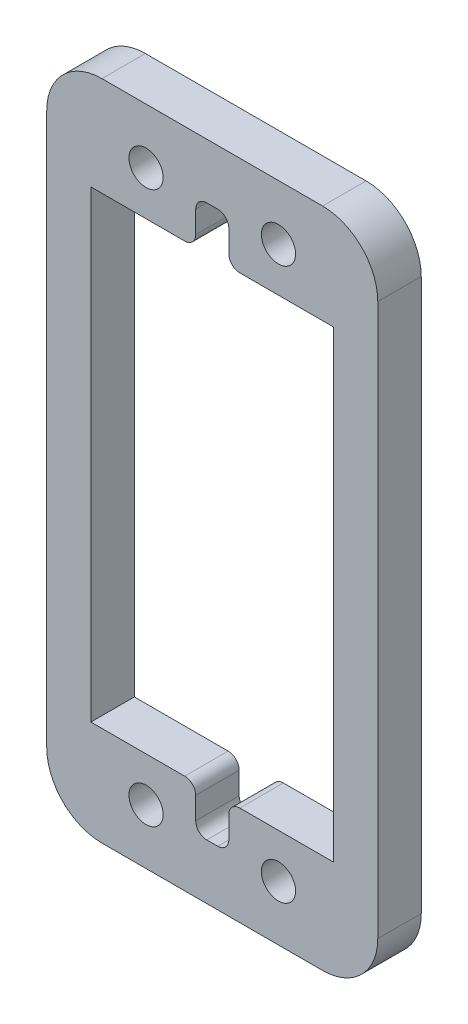
ISO-10303-21;
HEADER;
FILE_DESCRIPTION(('STEP AP214'),'2;1');
FILE_NAME('part.step','',(''),(''),'','','');
FILE_SCHEMA(('AUTOMOTIVE_DESIGN { 1 0 10303 214 1 1 1 1 }'));
ENDSEC;
DATA;
#1=APPLICATION_CONTEXT('core data for automotive mechanical design processes');
#2=APPLICATION_PROTOCOL_DEFINITION('international standard','automotive_design',2000,#1);
#3=PRODUCT_CONTEXT('',#1,'mechanical');
#4=PRODUCT('Part','Part','',(#3));
#5=PRODUCT_RELATED_PRODUCT_CATEGORY('part','',(#4));
#6=PRODUCT_DEFINITION_FORMATION('','',#4);
#7=PRODUCT_DEFINITION_CONTEXT('part definition',#1,'design');
#8=PRODUCT_DEFINITION('design','',#6,#7);
#9=PRODUCT_DEFINITION_SHAPE('','',#8);
#10=(LENGTH_UNIT() NAMED_UNIT(*) SI_UNIT(.MILLI.,.METRE.));
#11=(NAMED_UNIT(*) PLANE_ANGLE_UNIT() SI_UNIT($,.RADIAN.));
#12=(NAMED_UNIT(*) SI_UNIT($,.STERADIAN.) SOLID_ANGLE_UNIT());
#13=UNCERTAINTY_MEASURE_WITH_UNIT(LENGTH_MEASURE(1.E-05),#10,'distance_accuracy_value','');
#14=(GEOMETRIC_REPRESENTATION_CONTEXT(3) GLOBAL_UNCERTAINTY_ASSIGNED_CONTEXT((#13)) GLOBAL_UNIT_ASSIGNED_CONTEXT((#10,
#11,#12)) REPRESENTATION_CONTEXT('',''));
#15=CARTESIAN_POINT('',(0.,0.,0.));
#16=DIRECTION('',(0.,0.,1.));
#17=DIRECTION('',(1.,0.,0.));
#18=AXIS2_PLACEMENT_3D('',#15,#16,#17);
#19=CARTESIAN_POINT('',(11.,21.,3.94));
#20=DIRECTION('',(0.,1.,0.));
#21=DIRECTION('',(0.,0.,1.));
#22=AXIS2_PLACEMENT_3D('',#19,#20,#21);
#23=PLANE('',#22);
#24=DIRECTION('',(1.,0.,0.));
#25=VECTOR('',#24,1.);
#26=CARTESIAN_POINT('',(11.,21.,0.));
#27=LINE('',#26,#25);
#28=CARTESIAN_POINT('',(-11.,21.,0.));
#29=VERTEX_POINT('',#28);
#30=CARTESIAN_POINT('',(-2.5,21.,0.));
#31=VERTEX_POINT('',#30);
#32=EDGE_CURVE('E251',#29,#31,#27,.T.);
#33=ORIENTED_EDGE('',*,*,#32,.T.);
#34=DIRECTION('',(0.,0.,1.));
#35=VECTOR('',#34,1.);
#36=CARTESIAN_POINT('',(-2.5,21.,3.94));
#37=LINE('',#36,#35);
#38=CARTESIAN_POINT('',(-2.5,21.,3.94));
#39=VERTEX_POINT('',#38);
#40=EDGE_CURVE('E388',#31,#39,#37,.T.);
#41=ORIENTED_EDGE('',*,*,#40,.T.);
#42=DIRECTION('',(1.,0.,0.));
#43=VECTOR('',#42,1.);
#44=CARTESIAN_POINT('',(11.,21.,3.94));
#45=LINE('',#44,#43);
#46=CARTESIAN_POINT('',(-11.,21.,3.94));
#47=VERTEX_POINT('',#46);
#48=EDGE_CURVE('E238',#47,#39,#45,.T.);
#49=ORIENTED_EDGE('',*,*,#48,.F.);
#50=DIRECTION('',(0.,0.,-1.));
#51=VECTOR('',#50,1.);
#52=CARTESIAN_POINT('',(-11.,21.,3.94));
#53=LINE('',#52,#51);
#54=EDGE_CURVE('E279',#47,#29,#53,.T.);
#55=ORIENTED_EDGE('',*,*,#54,.T.);
#56=EDGE_LOOP('',(#33,#41,#49,#55));
#57=FACE_BOUND('',#56,.T.);
#58=ADVANCED_FACE('F41',(#57),#23,.F.);
#59=CARTESIAN_POINT('',(-11.,-21.,3.94));
#60=DIRECTION('',(0.,-1.,0.));
#61=DIRECTION('',(0.,0.,-1.));
#62=AXIS2_PLACEMENT_3D('',#59,#60,#61);
#63=PLANE('',#62);
#64=DIRECTION('',(-1.,0.,0.));
#65=VECTOR('',#64,1.);
#66=CARTESIAN_POINT('',(-11.,-21.,3.94));
#67=LINE('',#66,#65);
#68=CARTESIAN_POINT('',(-2.50000000000001,-21.,3.94));
#69=VERTEX_POINT('',#68);
#70=CARTESIAN_POINT('',(-11.,-21.,3.94));
#71=VERTEX_POINT('',#70);
#72=EDGE_CURVE('E246',#69,#71,#67,.T.);
#73=ORIENTED_EDGE('',*,*,#72,.F.);
#74=DIRECTION('',(0.,0.,-1.));
#75=VECTOR('',#74,1.);
#76=CARTESIAN_POINT('',(-2.50000000000001,-21.,3.94));
#77=LINE('',#76,#75);
#78=CARTESIAN_POINT('',(-2.50000000000001,-21.,0.));
#79=VERTEX_POINT('',#78);
#80=EDGE_CURVE('E353',#69,#79,#77,.T.);
#81=ORIENTED_EDGE('',*,*,#80,.T.);
#82=DIRECTION('',(-1.,0.,0.));
#83=VECTOR('',#82,1.);
#84=CARTESIAN_POINT('',(-11.,-21.,0.));
#85=LINE('',#84,#83);
#86=CARTESIAN_POINT('',(-11.,-21.,0.));
#87=VERTEX_POINT('',#86);
#88=EDGE_CURVE('E266',#79,#87,#85,.T.);
#89=ORIENTED_EDGE('',*,*,#88,.T.);
#90=DIRECTION('',(0.,0.,-1.));
#91=VECTOR('',#90,1.);
#92=CARTESIAN_POINT('',(-11.,-21.,3.94));
#93=LINE('',#92,#91);
#94=EDGE_CURVE('E240',#71,#87,#93,.T.);
#95=ORIENTED_EDGE('',*,*,#94,.F.);
#96=EDGE_LOOP('',(#73,#81,#89,#95));
#97=FACE_BOUND('',#96,.T.);
#98=ADVANCED_FACE('F520',(#97),#63,.F.);
#99=CARTESIAN_POINT('',(-15.,-30.,3.94));
#100=DIRECTION('',(1.,0.,0.));
#101=DIRECTION('',(0.,0.,-1.));
#102=AXIS2_PLACEMENT_3D('',#99,#100,#101);
#103=PLANE('',#102);
#104=DIRECTION('',(0.,-1.,0.));
#105=VECTOR('',#104,1.);
#106=CARTESIAN_POINT('',(-15.,-30.,0.));
#107=LINE('',#106,#105);
#108=CARTESIAN_POINT('',(-15.,25.,0.));
#109=VERTEX_POINT('',#108);
#110=CARTESIAN_POINT('',(-15.,-25.,0.));
#111=VERTEX_POINT('',#110);
#112=EDGE_CURVE('E280',#109,#111,#107,.T.);
#113=ORIENTED_EDGE('',*,*,#112,.T.);
#114=DIRECTION('',(0.,0.,-1.));
#115=VECTOR('',#114,1.);
#116=CARTESIAN_POINT('',(-15.,-25.,3.94));
#117=LINE('',#116,#115);
#118=CARTESIAN_POINT('',(-15.,-25.,3.94));
#119=VERTEX_POINT('',#118);
#120=EDGE_CURVE('E322',#111,#119,#117,.F.);
#121=ORIENTED_EDGE('',*,*,#120,.T.);
#122=DIRECTION('',(0.,-1.,0.));
#123=VECTOR('',#122,1.);
#124=CARTESIAN_POINT('',(-15.,-30.,3.94));
#125=LINE('',#124,#123);
#126=CARTESIAN_POINT('',(-15.,25.,3.94));
#127=VERTEX_POINT('',#126);
#128=EDGE_CURVE('E281',#127,#119,#125,.T.);
#129=ORIENTED_EDGE('',*,*,#128,.F.);
#130=DIRECTION('',(0.,0.,-1.));
#131=VECTOR('',#130,1.);
#132=CARTESIAN_POINT('',(-15.,25.,3.94));
#133=LINE('',#132,#131);
#134=EDGE_CURVE('E319',#127,#109,#133,.T.);
#135=ORIENTED_EDGE('',*,*,#134,.T.);
#136=EDGE_LOOP('',(#113,#121,#129,#135));
#137=FACE_BOUND('',#136,.T.);
#138=ADVANCED_FACE('F497',(#137),#103,.F.);
#139=CARTESIAN_POINT('',(15.,-30.,3.94));
#140=DIRECTION('',(0.,1.,0.));
#141=DIRECTION('',(0.,0.,1.));
#142=AXIS2_PLACEMENT_3D('',#139,#140,#141);
#143=PLANE('',#142);
#144=DIRECTION('',(1.,0.,0.));
#145=VECTOR('',#144,1.);
#146=CARTESIAN_POINT('',(15.,-30.,3.94));
#147=LINE('',#146,#145);
#148=CARTESIAN_POINT('',(-10.,-30.,3.94));
#149=VERTEX_POINT('',#148);
#150=CARTESIAN_POINT('',(10.,-30.,3.94));
#151=VERTEX_POINT('',#150);
#152=EDGE_CURVE('E282',#149,#151,#147,.T.);
#153=ORIENTED_EDGE('',*,*,#152,.F.);
#154=DIRECTION('',(0.,0.,-1.));
#155=VECTOR('',#154,1.);
#156=CARTESIAN_POINT('',(-10.,-30.,3.94));
#157=LINE('',#156,#155);
#158=CARTESIAN_POINT('',(-10.,-30.,0.));
#159=VERTEX_POINT('',#158);
#160=EDGE_CURVE('E310',#149,#159,#157,.T.);
#161=ORIENTED_EDGE('',*,*,#160,.T.);
#162=DIRECTION('',(1.,0.,0.));
#163=VECTOR('',#162,1.);
#164=CARTESIAN_POINT('',(15.,-30.,0.));
#165=LINE('',#164,#163);
#166=CARTESIAN_POINT('',(10.,-30.,0.));
#167=VERTEX_POINT('',#166);
#168=EDGE_CURVE('E296',#159,#167,#165,.T.);
#169=ORIENTED_EDGE('',*,*,#168,.T.);
#170=DIRECTION('',(0.,0.,-1.));
#171=VECTOR('',#170,1.);
#172=CARTESIAN_POINT('',(10.,-30.,3.94));
#173=LINE('',#172,#171);
#174=EDGE_CURVE('E294',#167,#151,#173,.F.);
#175=ORIENTED_EDGE('',*,*,#174,.T.);
#176=EDGE_LOOP('',(#153,#161,#169,#175));
#177=FACE_BOUND('',#176,.T.);
#178=ADVANCED_FACE('F475',(#177),#143,.F.);
#179=CARTESIAN_POINT('',(15.,30.,3.94));
#180=DIRECTION('',(-1.,0.,0.));
#181=DIRECTION('',(0.,-1.,0.));
#182=AXIS2_PLACEMENT_3D('',#179,#180,#181);
#183=PLANE('',#182);
#184=DIRECTION('',(0.,1.,0.));
#185=VECTOR('',#184,1.);
#186=CARTESIAN_POINT('',(15.,30.,3.94));
#187=LINE('',#186,#185);
#188=CARTESIAN_POINT('',(15.,-25.,3.94));
#189=VERTEX_POINT('',#188);
#190=CARTESIAN_POINT('',(15.,25.,3.94));
#191=VERTEX_POINT('',#190);
#192=EDGE_CURVE('E289',#189,#191,#187,.T.);
#193=ORIENTED_EDGE('',*,*,#192,.F.);
#194=DIRECTION('',(0.,0.,-1.));
#195=VECTOR('',#194,1.);
#196=CARTESIAN_POINT('',(15.,-25.,3.94));
#197=LINE('',#196,#195);
#198=CARTESIAN_POINT('',(15.,-25.,0.));
#199=VERTEX_POINT('',#198);
#200=EDGE_CURVE('E331',#189,#199,#197,.T.);
#201=ORIENTED_EDGE('',*,*,#200,.T.);
#202=DIRECTION('',(0.,1.,0.));
#203=VECTOR('',#202,1.);
#204=CARTESIAN_POINT('',(15.,30.,0.));
#205=LINE('',#204,#203);
#206=CARTESIAN_POINT('',(15.,25.,0.));
#207=VERTEX_POINT('',#206);
#208=EDGE_CURVE('E301',#199,#207,#205,.T.);
#209=ORIENTED_EDGE('',*,*,#208,.T.);
#210=DIRECTION('',(0.,0.,-1.));
#211=VECTOR('',#210,1.);
#212=CARTESIAN_POINT('',(15.,25.,3.94));
#213=LINE('',#212,#211);
#214=EDGE_CURVE('E333',#207,#191,#213,.F.);
#215=ORIENTED_EDGE('',*,*,#214,.T.);
#216=EDGE_LOOP('',(#193,#201,#209,#215));
#217=FACE_BOUND('',#216,.T.);
#218=ADVANCED_FACE('F485',(#217),#183,.F.);
#219=CARTESIAN_POINT('',(-15.,30.,3.94));
#220=DIRECTION('',(0.,-1.,0.));
#221=DIRECTION('',(0.,0.,-1.));
#222=AXIS2_PLACEMENT_3D('',#219,#220,#221);
#223=PLANE('',#222);
#224=DIRECTION('',(-1.,0.,0.));
#225=VECTOR('',#224,1.);
#226=CARTESIAN_POINT('',(-15.,30.,3.94));
#227=LINE('',#226,#225);
#228=CARTESIAN_POINT('',(9.99999999999999,30.,3.94));
#229=VERTEX_POINT('',#228);
#230=CARTESIAN_POINT('',(-10.,30.,3.94));
#231=VERTEX_POINT('',#230);
#232=EDGE_CURVE('E292',#229,#231,#227,.T.);
#233=ORIENTED_EDGE('',*,*,#232,.F.);
#234=DIRECTION('',(0.,0.,-1.));
#235=VECTOR('',#234,1.);
#236=CARTESIAN_POINT('',(10.,30.,3.94));
#237=LINE('',#236,#235);
#238=CARTESIAN_POINT('',(9.99999999999999,30.,0.));
#239=VERTEX_POINT('',#238);
#240=EDGE_CURVE('E336',#229,#239,#237,.T.);
#241=ORIENTED_EDGE('',*,*,#240,.T.);
#242=DIRECTION('',(-1.,0.,0.));
#243=VECTOR('',#242,1.);
#244=CARTESIAN_POINT('',(-15.,30.,0.));
#245=LINE('',#244,#243);
#246=CARTESIAN_POINT('',(-10.,30.,0.));
#247=VERTEX_POINT('',#246);
#248=EDGE_CURVE('E288',#239,#247,#245,.T.);
#249=ORIENTED_EDGE('',*,*,#248,.T.);
#250=DIRECTION('',(0.,0.,-1.));
#251=VECTOR('',#250,1.);
#252=CARTESIAN_POINT('',(-10.,30.,3.94));
#253=LINE('',#252,#251);
#254=EDGE_CURVE('E337',#247,#231,#253,.F.);
#255=ORIENTED_EDGE('',*,*,#254,.T.);
#256=EDGE_LOOP('',(#233,#241,#249,#255));
#257=FACE_BOUND('',#256,.T.);
#258=ADVANCED_FACE('F489',(#257),#223,.F.);
#259=CARTESIAN_POINT('',(0.,0.,3.94));
#260=DIRECTION('',(0.,0.,-1.));
#261=DIRECTION('',(-1.,0.,0.));
#262=AXIS2_PLACEMENT_3D('',#259,#260,#261);
#263=PLANE('',#262);
#264=CARTESIAN_POINT('',(-6.,25.,3.94));
#265=DIRECTION('',(0.,0.,-1.));
#266=DIRECTION('',(-1.,0.,0.));
#267=AXIS2_PLACEMENT_3D('',#264,#265,#266);
#268=CIRCLE('',#267,1.55);
#269=CARTESIAN_POINT('',(-7.55,25.,3.94));
#270=VERTEX_POINT('',#269);
#271=EDGE_CURVE('E450',#270,#270,#268,.T.);
#272=ORIENTED_EDGE('',*,*,#271,.T.);
#273=EDGE_LOOP('',(#272));
#274=FACE_BOUND('',#273,.T.);
#275=CARTESIAN_POINT('',(6.,-25.,3.94));
#276=DIRECTION('',(0.,0.,-1.));
#277=DIRECTION('',(-1.,0.,0.));
#278=AXIS2_PLACEMENT_3D('',#275,#276,#277);
#279=CIRCLE('',#278,1.55);
#280=CARTESIAN_POINT('',(4.45,-25.,3.94));
#281=VERTEX_POINT('',#280);
#282=EDGE_CURVE('E454',#281,#281,#279,.T.);
#283=ORIENTED_EDGE('',*,*,#282,.T.);
#284=EDGE_LOOP('',(#283));
#285=FACE_BOUND('',#284,.T.);
#286=CARTESIAN_POINT('',(-6.,-25.,3.94));
#287=DIRECTION('',(0.,0.,-1.));
#288=DIRECTION('',(-1.,0.,0.));
#289=AXIS2_PLACEMENT_3D('',#286,#287,#288);
#290=CIRCLE('',#289,1.55);
#291=CARTESIAN_POINT('',(-7.55,-25.,3.94));
#292=VERTEX_POINT('',#291);
#293=EDGE_CURVE('E853',#292,#292,#290,.T.);
#294=ORIENTED_EDGE('',*,*,#293,.T.);
#295=EDGE_LOOP('',(#294));
#296=FACE_BOUND('',#295,.T.);
#297=DIRECTION('',(0.,1.,0.));
#298=VECTOR('',#297,1.);
#299=CARTESIAN_POINT('',(-1.5,25.,3.94));
#300=LINE('',#299,#298);
#301=CARTESIAN_POINT('',(-1.50000000000001,-24.,3.94));
#302=VERTEX_POINT('',#301);
#303=CARTESIAN_POINT('',(-1.50000000000001,-22.,3.94));
#304=VERTEX_POINT('',#303);
#305=EDGE_CURVE('E440',#302,#304,#300,.T.);
#306=ORIENTED_EDGE('',*,*,#305,.T.);
#307=CARTESIAN_POINT('',(-2.50000000000001,-22.,3.94));
#308=DIRECTION('',(0.,0.,-1.));
#309=DIRECTION('',(-1.,0.,0.));
#310=AXIS2_PLACEMENT_3D('',#307,#308,#309);
#311=CIRCLE('',#310,1.);
#312=EDGE_CURVE('E370',#304,#69,#311,.F.);
#313=ORIENTED_EDGE('',*,*,#312,.T.);
#314=ORIENTED_EDGE('',*,*,#72,.T.);
#315=DIRECTION('',(0.,1.,0.));
#316=VECTOR('',#315,1.);
#317=CARTESIAN_POINT('',(-11.,21.,3.94));
#318=LINE('',#317,#316);
#319=EDGE_CURVE('E244',#71,#47,#318,.T.);
#320=ORIENTED_EDGE('',*,*,#319,.T.);
#321=ORIENTED_EDGE('',*,*,#48,.T.);
#322=CARTESIAN_POINT('',(-2.5,22.,3.94));
#323=DIRECTION('',(0.,0.,-1.));
#324=DIRECTION('',(-1.,0.,0.));
#325=AXIS2_PLACEMENT_3D('',#322,#323,#324);
#326=CIRCLE('',#325,1.);
#327=CARTESIAN_POINT('',(-1.5,22.,3.94));
#328=VERTEX_POINT('',#327);
#329=EDGE_CURVE('E365',#39,#328,#326,.F.);
#330=ORIENTED_EDGE('',*,*,#329,.T.);
#331=CARTESIAN_POINT('',(-1.5,24.,3.94));
#332=VERTEX_POINT('',#331);
#333=EDGE_CURVE('E431',#328,#332,#300,.T.);
#334=ORIENTED_EDGE('',*,*,#333,.T.);
#335=CARTESIAN_POINT('',(-0.5,24.,3.94));
#336=DIRECTION('',(0.,0.,-1.));
#337=DIRECTION('',(-1.,0.,0.));
#338=AXIS2_PLACEMENT_3D('',#335,#336,#337);
#339=CIRCLE('',#338,1.);
#340=CARTESIAN_POINT('',(-0.5,25.,3.94));
#341=VERTEX_POINT('',#340);
#342=EDGE_CURVE('E11',#332,#341,#339,.T.);
#343=ORIENTED_EDGE('',*,*,#342,.T.);
#344=DIRECTION('',(1.,0.,0.));
#345=VECTOR('',#344,1.);
#346=CARTESIAN_POINT('',(1.5,25.,3.94));
#347=LINE('',#346,#345);
#348=CARTESIAN_POINT('',(0.5,25.,3.94));
#349=VERTEX_POINT('',#348);
#350=EDGE_CURVE('E429',#341,#349,#347,.T.);
#351=ORIENTED_EDGE('',*,*,#350,.T.);
#352=CARTESIAN_POINT('',(0.5,24.,3.94));
#353=DIRECTION('',(0.,0.,-1.));
#354=DIRECTION('',(-1.,0.,0.));
#355=AXIS2_PLACEMENT_3D('',#352,#353,#354);
#356=CIRCLE('',#355,1.);
#357=CARTESIAN_POINT('',(1.5,24.,3.94));
#358=VERTEX_POINT('',#357);
#359=EDGE_CURVE('E401',#349,#358,#356,.T.);
#360=ORIENTED_EDGE('',*,*,#359,.T.);
#361=DIRECTION('',(0.,-1.,0.));
#362=VECTOR('',#361,1.);
#363=CARTESIAN_POINT('',(1.5,21.,3.94));
#364=LINE('',#363,#362);
#365=CARTESIAN_POINT('',(1.5,22.,3.94));
#366=VERTEX_POINT('',#365);
#367=EDGE_CURVE('E434',#358,#366,#364,.T.);
#368=ORIENTED_EDGE('',*,*,#367,.T.);
#369=CARTESIAN_POINT('',(2.5,22.,3.94));
#370=DIRECTION('',(0.,0.,-1.));
#371=DIRECTION('',(-1.,0.,0.));
#372=AXIS2_PLACEMENT_3D('',#369,#370,#371);
#373=CIRCLE('',#372,1.);
#374=CARTESIAN_POINT('',(2.5,21.,3.94));
#375=VERTEX_POINT('',#374);
#376=EDGE_CURVE('E364',#366,#375,#373,.F.);
#377=ORIENTED_EDGE('',*,*,#376,.T.);
#378=CARTESIAN_POINT('',(11.,21.,3.94));
#379=VERTEX_POINT('',#378);
#380=EDGE_CURVE('E255',#375,#379,#45,.T.);
#381=ORIENTED_EDGE('',*,*,#380,.T.);
#382=DIRECTION('',(0.,-1.,0.));
#383=VECTOR('',#382,1.);
#384=CARTESIAN_POINT('',(11.,-21.,3.94));
#385=LINE('',#384,#383);
#386=CARTESIAN_POINT('',(11.,-21.,3.94));
#387=VERTEX_POINT('',#386);
#388=EDGE_CURVE('E233',#379,#387,#385,.T.);
#389=ORIENTED_EDGE('',*,*,#388,.T.);
#390=CARTESIAN_POINT('',(2.49999999999999,-21.,3.94));
#391=VERTEX_POINT('',#390);
#392=EDGE_CURVE('E241',#387,#391,#67,.T.);
#393=ORIENTED_EDGE('',*,*,#392,.T.);
#394=CARTESIAN_POINT('',(2.49999999999999,-22.,3.94));
#395=DIRECTION('',(0.,0.,-1.));
#396=DIRECTION('',(-1.,0.,0.));
#397=AXIS2_PLACEMENT_3D('',#394,#395,#396);
#398=CIRCLE('',#397,1.);
#399=CARTESIAN_POINT('',(1.49999999999999,-22.,3.94));
#400=VERTEX_POINT('',#399);
#401=EDGE_CURVE('E64',#391,#400,#398,.F.);
#402=ORIENTED_EDGE('',*,*,#401,.T.);
#403=CARTESIAN_POINT('',(1.49999999999999,-24.,3.94));
#404=VERTEX_POINT('',#403);
#405=EDGE_CURVE('E439',#400,#404,#364,.T.);
#406=ORIENTED_EDGE('',*,*,#405,.T.);
#407=CARTESIAN_POINT('',(0.499999999999994,-24.,3.94));
#408=DIRECTION('',(0.,0.,-1.));
#409=DIRECTION('',(-1.,0.,0.));
#410=AXIS2_PLACEMENT_3D('',#407,#408,#409);
#411=CIRCLE('',#410,1.);
#412=CARTESIAN_POINT('',(0.499999999999994,-25.,3.94));
#413=VERTEX_POINT('',#412);
#414=EDGE_CURVE('E399',#404,#413,#411,.T.);
#415=ORIENTED_EDGE('',*,*,#414,.T.);
#416=DIRECTION('',(-1.,0.,0.));
#417=VECTOR('',#416,1.);
#418=CARTESIAN_POINT('',(-1.50000000000001,-25.,3.94));
#419=LINE('',#418,#417);
#420=CARTESIAN_POINT('',(-0.500000000000006,-25.,3.94));
#421=VERTEX_POINT('',#420);
#422=EDGE_CURVE('E556',#413,#421,#419,.T.);
#423=ORIENTED_EDGE('',*,*,#422,.T.);
#424=CARTESIAN_POINT('',(-0.500000000000006,-24.,3.94));
#425=DIRECTION('',(0.,0.,-1.));
#426=DIRECTION('',(-1.,0.,0.));
#427=AXIS2_PLACEMENT_3D('',#424,#425,#426);
#428=CIRCLE('',#427,1.);
#429=EDGE_CURVE('E392',#421,#302,#428,.T.);
#430=ORIENTED_EDGE('',*,*,#429,.T.);
#431=EDGE_LOOP('',(#306,#313,#314,#320,#321,#330,#334,#343,#351,#360,#368,#377,#381,#389,#393,
#402,#406,#415,#423,#430));
#432=FACE_BOUND('',#431,.T.);
#433=CARTESIAN_POINT('',(6.,25.,3.94));
#434=DIRECTION('',(0.,0.,-1.));
#435=DIRECTION('',(-1.,0.,0.));
#436=AXIS2_PLACEMENT_3D('',#433,#434,#435);
#437=CIRCLE('',#436,1.55);
#438=CARTESIAN_POINT('',(4.45,25.,3.94));
#439=VERTEX_POINT('',#438);
#440=EDGE_CURVE('E269',#439,#439,#437,.T.);
#441=ORIENTED_EDGE('',*,*,#440,.T.);
#442=EDGE_LOOP('',(#441));
#443=FACE_BOUND('',#442,.T.);
#444=ORIENTED_EDGE('',*,*,#128,.T.);
#445=CARTESIAN_POINT('',(-10.,-25.,3.94));
#446=DIRECTION('',(0.,0.,-1.));
#447=DIRECTION('',(-1.,0.,0.));
#448=AXIS2_PLACEMENT_3D('',#445,#446,#447);
#449=CIRCLE('',#448,5.);
#450=EDGE_CURVE('E328',#119,#149,#449,.F.);
#451=ORIENTED_EDGE('',*,*,#450,.T.);
#452=ORIENTED_EDGE('',*,*,#152,.T.);
#453=CARTESIAN_POINT('',(10.,-25.,3.94));
#454=DIRECTION('',(0.,0.,-1.));
#455=DIRECTION('',(-1.,0.,0.));
#456=AXIS2_PLACEMENT_3D('',#453,#454,#455);
#457=CIRCLE('',#456,5.);
#458=EDGE_CURVE('E326',#151,#189,#457,.F.);
#459=ORIENTED_EDGE('',*,*,#458,.T.);
#460=ORIENTED_EDGE('',*,*,#192,.T.);
#461=CARTESIAN_POINT('',(10.,25.,3.94));
#462=DIRECTION('',(0.,0.,-1.));
#463=DIRECTION('',(-1.,0.,0.));
#464=AXIS2_PLACEMENT_3D('',#461,#462,#463);
#465=CIRCLE('',#464,5.);
#466=EDGE_CURVE('E323',#191,#229,#465,.F.);
#467=ORIENTED_EDGE('',*,*,#466,.T.);
#468=ORIENTED_EDGE('',*,*,#232,.T.);
#469=CARTESIAN_POINT('',(-10.,25.,3.94));
#470=DIRECTION('',(0.,0.,-1.));
#471=DIRECTION('',(-1.,0.,0.));
#472=AXIS2_PLACEMENT_3D('',#469,#470,#471);
#473=CIRCLE('',#472,5.);
#474=EDGE_CURVE('E324',#231,#127,#473,.F.);
#475=ORIENTED_EDGE('',*,*,#474,.T.);
#476=EDGE_LOOP('',(#444,#451,#452,#459,#460,#467,#468,#475));
#477=FACE_BOUND('',#476,.T.);
#478=ADVANCED_FACE('F248',(#274,#285,#296,#432,#443,#477),#263,.F.);
#479=CARTESIAN_POINT('',(0.,0.,0.));
#480=DIRECTION('',(0.,0.,-1.));
#481=DIRECTION('',(-1.,0.,0.));
#482=AXIS2_PLACEMENT_3D('',#479,#480,#481);
#483=PLANE('',#482);
#484=CARTESIAN_POINT('',(-6.,25.,0.));
#485=DIRECTION('',(0.,0.,-1.));
#486=DIRECTION('',(-1.,0.,0.));
#487=AXIS2_PLACEMENT_3D('',#484,#485,#486);
#488=CIRCLE('',#487,1.55);
#489=CARTESIAN_POINT('',(-7.55,25.,0.));
#490=VERTEX_POINT('',#489);
#491=EDGE_CURVE('E443',#490,#490,#488,.T.);
#492=ORIENTED_EDGE('',*,*,#491,.F.);
#493=EDGE_LOOP('',(#492));
#494=FACE_BOUND('',#493,.T.);
#495=CARTESIAN_POINT('',(6.,-25.,0.));
#496=DIRECTION('',(0.,0.,-1.));
#497=DIRECTION('',(-1.,0.,0.));
#498=AXIS2_PLACEMENT_3D('',#495,#496,#497);
#499=CIRCLE('',#498,1.55);
#500=CARTESIAN_POINT('',(4.45,-25.,0.));
#501=VERTEX_POINT('',#500);
#502=EDGE_CURVE('E448',#501,#501,#499,.T.);
#503=ORIENTED_EDGE('',*,*,#502,.F.);
#504=EDGE_LOOP('',(#503));
#505=FACE_BOUND('',#504,.T.);
#506=CARTESIAN_POINT('',(-6.,-25.,0.));
#507=DIRECTION('',(0.,0.,-1.));
#508=DIRECTION('',(-1.,0.,0.));
#509=AXIS2_PLACEMENT_3D('',#506,#507,#508);
#510=CIRCLE('',#509,1.55);
#511=CARTESIAN_POINT('',(-7.55,-25.,0.));
#512=VERTEX_POINT('',#511);
#513=EDGE_CURVE('E453',#512,#512,#510,.T.);
#514=ORIENTED_EDGE('',*,*,#513,.F.);
#515=EDGE_LOOP('',(#514));
#516=FACE_BOUND('',#515,.T.);
#517=ORIENTED_EDGE('',*,*,#88,.F.);
#518=CARTESIAN_POINT('',(-2.50000000000001,-22.,0.));
#519=DIRECTION('',(0.,0.,-1.));
#520=DIRECTION('',(-1.,0.,0.));
#521=AXIS2_PLACEMENT_3D('',#518,#519,#520);
#522=CIRCLE('',#521,1.);
#523=CARTESIAN_POINT('',(-1.50000000000001,-22.,0.));
#524=VERTEX_POINT('',#523);
#525=EDGE_CURVE('E359',#79,#524,#522,.T.);
#526=ORIENTED_EDGE('',*,*,#525,.T.);
#527=DIRECTION('',(0.,1.,0.));
#528=VECTOR('',#527,1.);
#529=CARTESIAN_POINT('',(-1.5,25.,0.));
#530=LINE('',#529,#528);
#531=CARTESIAN_POINT('',(-1.50000000000001,-24.,0.));
#532=VERTEX_POINT('',#531);
#533=EDGE_CURVE('E421',#532,#524,#530,.T.);
#534=ORIENTED_EDGE('',*,*,#533,.F.);
#535=CARTESIAN_POINT('',(-0.500000000000006,-24.,0.));
#536=DIRECTION('',(0.,0.,-1.));
#537=DIRECTION('',(-1.,0.,0.));
#538=AXIS2_PLACEMENT_3D('',#535,#536,#537);
#539=CIRCLE('',#538,1.);
#540=CARTESIAN_POINT('',(-0.500000000000006,-25.,0.));
#541=VERTEX_POINT('',#540);
#542=EDGE_CURVE('E395',#532,#541,#539,.F.);
#543=ORIENTED_EDGE('',*,*,#542,.T.);
#544=DIRECTION('',(-1.,0.,0.));
#545=VECTOR('',#544,1.);
#546=CARTESIAN_POINT('',(-1.50000000000001,-25.,0.));
#547=LINE('',#546,#545);
#548=CARTESIAN_POINT('',(0.499999999999994,-25.,0.));
#549=VERTEX_POINT('',#548);
#550=EDGE_CURVE('E554',#549,#541,#547,.T.);
#551=ORIENTED_EDGE('',*,*,#550,.F.);
#552=CARTESIAN_POINT('',(0.499999999999994,-24.,0.));
#553=DIRECTION('',(0.,0.,-1.));
#554=DIRECTION('',(-1.,0.,0.));
#555=AXIS2_PLACEMENT_3D('',#552,#553,#554);
#556=CIRCLE('',#555,1.);
#557=CARTESIAN_POINT('',(1.49999999999999,-24.,0.));
#558=VERTEX_POINT('',#557);
#559=EDGE_CURVE('E400',#549,#558,#556,.F.);
#560=ORIENTED_EDGE('',*,*,#559,.T.);
#561=DIRECTION('',(0.,-1.,0.));
#562=VECTOR('',#561,1.);
#563=CARTESIAN_POINT('',(1.49999999999999,-25.,0.));
#564=LINE('',#563,#562);
#565=CARTESIAN_POINT('',(1.49999999999999,-22.,0.));
#566=VERTEX_POINT('',#565);
#567=EDGE_CURVE('E552',#566,#558,#564,.T.);
#568=ORIENTED_EDGE('',*,*,#567,.F.);
#569=CARTESIAN_POINT('',(2.49999999999999,-22.,0.));
#570=DIRECTION('',(0.,0.,-1.));
#571=DIRECTION('',(-1.,0.,0.));
#572=AXIS2_PLACEMENT_3D('',#569,#570,#571);
#573=CIRCLE('',#572,1.);
#574=CARTESIAN_POINT('',(2.49999999999999,-21.,0.));
#575=VERTEX_POINT('',#574);
#576=EDGE_CURVE('E356',#566,#575,#573,.T.);
#577=ORIENTED_EDGE('',*,*,#576,.T.);
#578=CARTESIAN_POINT('',(11.,-21.,0.));
#579=VERTEX_POINT('',#578);
#580=EDGE_CURVE('E267',#579,#575,#85,.T.);
#581=ORIENTED_EDGE('',*,*,#580,.F.);
#582=DIRECTION('',(0.,-1.,0.));
#583=VECTOR('',#582,1.);
#584=CARTESIAN_POINT('',(11.,-21.,0.));
#585=LINE('',#584,#583);
#586=CARTESIAN_POINT('',(11.,21.,0.));
#587=VERTEX_POINT('',#586);
#588=EDGE_CURVE('E231',#587,#579,#585,.T.);
#589=ORIENTED_EDGE('',*,*,#588,.F.);
#590=CARTESIAN_POINT('',(2.5,21.,0.));
#591=VERTEX_POINT('',#590);
#592=EDGE_CURVE('E260',#591,#587,#27,.T.);
#593=ORIENTED_EDGE('',*,*,#592,.F.);
#594=CARTESIAN_POINT('',(2.5,22.,0.));
#595=DIRECTION('',(0.,0.,-1.));
#596=DIRECTION('',(-1.,0.,0.));
#597=AXIS2_PLACEMENT_3D('',#594,#595,#596);
#598=CIRCLE('',#597,1.);
#599=CARTESIAN_POINT('',(1.5,22.,0.));
#600=VERTEX_POINT('',#599);
#601=EDGE_CURVE('E358',#591,#600,#598,.T.);
#602=ORIENTED_EDGE('',*,*,#601,.T.);
#603=CARTESIAN_POINT('',(1.5,24.,0.));
#604=VERTEX_POINT('',#603);
#605=EDGE_CURVE('E550',#604,#600,#564,.T.);
#606=ORIENTED_EDGE('',*,*,#605,.F.);
#607=CARTESIAN_POINT('',(0.5,24.,0.));
#608=DIRECTION('',(0.,0.,-1.));
#609=DIRECTION('',(-1.,0.,0.));
#610=AXIS2_PLACEMENT_3D('',#607,#608,#609);
#611=CIRCLE('',#610,1.);
#612=CARTESIAN_POINT('',(0.5,25.,0.));
#613=VERTEX_POINT('',#612);
#614=EDGE_CURVE('E402',#604,#613,#611,.F.);
#615=ORIENTED_EDGE('',*,*,#614,.T.);
#616=DIRECTION('',(1.,0.,0.));
#617=VECTOR('',#616,1.);
#618=CARTESIAN_POINT('',(1.5,25.,0.));
#619=LINE('',#618,#617);
#620=CARTESIAN_POINT('',(-0.5,25.,0.));
#621=VERTEX_POINT('',#620);
#622=EDGE_CURVE('E413',#621,#613,#619,.T.);
#623=ORIENTED_EDGE('',*,*,#622,.F.);
#624=CARTESIAN_POINT('',(-0.5,24.,0.));
#625=DIRECTION('',(0.,0.,-1.));
#626=DIRECTION('',(-1.,0.,0.));
#627=AXIS2_PLACEMENT_3D('',#624,#625,#626);
#628=CIRCLE('',#627,1.);
#629=CARTESIAN_POINT('',(-1.5,24.,0.));
#630=VERTEX_POINT('',#629);
#631=EDGE_CURVE('E47',#621,#630,#628,.F.);
#632=ORIENTED_EDGE('',*,*,#631,.T.);
#633=CARTESIAN_POINT('',(-1.5,22.,0.));
#634=VERTEX_POINT('',#633);
#635=EDGE_CURVE('E414',#634,#630,#530,.T.);
#636=ORIENTED_EDGE('',*,*,#635,.F.);
#637=CARTESIAN_POINT('',(-2.5,22.,0.));
#638=DIRECTION('',(0.,0.,-1.));
#639=DIRECTION('',(-1.,0.,0.));
#640=AXIS2_PLACEMENT_3D('',#637,#638,#639);
#641=CIRCLE('',#640,1.);
#642=EDGE_CURVE('E354',#634,#31,#641,.T.);
#643=ORIENTED_EDGE('',*,*,#642,.T.);
#644=ORIENTED_EDGE('',*,*,#32,.F.);
#645=DIRECTION('',(0.,1.,0.));
#646=VECTOR('',#645,1.);
#647=CARTESIAN_POINT('',(-11.,21.,0.));
#648=LINE('',#647,#646);
#649=EDGE_CURVE('E275',#87,#29,#648,.T.);
#650=ORIENTED_EDGE('',*,*,#649,.F.);
#651=EDGE_LOOP('',(#517,#526,#534,#543,#551,#560,#568,#577,#581,#589,#593,#602,#606,#615,#623,
#632,#636,#643,#644,#650));
#652=FACE_BOUND('',#651,.T.);
#653=CARTESIAN_POINT('',(6.,25.,0.));
#654=DIRECTION('',(0.,0.,-1.));
#655=DIRECTION('',(-1.,0.,0.));
#656=AXIS2_PLACEMENT_3D('',#653,#654,#655);
#657=CIRCLE('',#656,1.55);
#658=CARTESIAN_POINT('',(4.45,25.,0.));
#659=VERTEX_POINT('',#658);
#660=EDGE_CURVE('E258',#659,#659,#657,.T.);
#661=ORIENTED_EDGE('',*,*,#660,.F.);
#662=EDGE_LOOP('',(#661));
#663=FACE_BOUND('',#662,.T.);
#664=ORIENTED_EDGE('',*,*,#168,.F.);
#665=CARTESIAN_POINT('',(-10.,-25.,0.));
#666=DIRECTION('',(0.,0.,-1.));
#667=DIRECTION('',(-1.,0.,0.));
#668=AXIS2_PLACEMENT_3D('',#665,#666,#667);
#669=CIRCLE('',#668,5.);
#670=EDGE_CURVE('E317',#159,#111,#669,.T.);
#671=ORIENTED_EDGE('',*,*,#670,.T.);
#672=ORIENTED_EDGE('',*,*,#112,.F.);
#673=CARTESIAN_POINT('',(-10.,25.,0.));
#674=DIRECTION('',(0.,0.,-1.));
#675=DIRECTION('',(-1.,0.,0.));
#676=AXIS2_PLACEMENT_3D('',#673,#674,#675);
#677=CIRCLE('',#676,5.);
#678=EDGE_CURVE('E309',#109,#247,#677,.T.);
#679=ORIENTED_EDGE('',*,*,#678,.T.);
#680=ORIENTED_EDGE('',*,*,#248,.F.);
#681=CARTESIAN_POINT('',(10.,25.,0.));
#682=DIRECTION('',(0.,0.,-1.));
#683=DIRECTION('',(-1.,0.,0.));
#684=AXIS2_PLACEMENT_3D('',#681,#682,#683);
#685=CIRCLE('',#684,5.);
#686=EDGE_CURVE('E315',#239,#207,#685,.T.);
#687=ORIENTED_EDGE('',*,*,#686,.T.);
#688=ORIENTED_EDGE('',*,*,#208,.F.);
#689=CARTESIAN_POINT('',(10.,-25.,0.));
#690=DIRECTION('',(0.,0.,-1.));
#691=DIRECTION('',(-1.,0.,0.));
#692=AXIS2_PLACEMENT_3D('',#689,#690,#691);
#693=CIRCLE('',#692,5.);
#694=EDGE_CURVE('E313',#199,#167,#693,.T.);
#695=ORIENTED_EDGE('',*,*,#694,.T.);
#696=EDGE_LOOP('',(#664,#671,#672,#679,#680,#687,#688,#695));
#697=FACE_BOUND('',#696,.T.);
#698=ADVANCED_FACE('F406',(#494,#505,#516,#652,#663,#697),#483,.T.);
#699=CARTESIAN_POINT('',(11.,-21.,3.94));
#700=DIRECTION('',(1.,0.,0.));
#701=DIRECTION('',(0.,0.,-1.));
#702=AXIS2_PLACEMENT_3D('',#699,#700,#701);
#703=PLANE('',#702);
#704=ORIENTED_EDGE('',*,*,#588,.T.);
#705=DIRECTION('',(0.,0.,-1.));
#706=VECTOR('',#705,1.);
#707=CARTESIAN_POINT('',(11.,-21.,3.94));
#708=LINE('',#707,#706);
#709=EDGE_CURVE('E228',#387,#579,#708,.T.);
#710=ORIENTED_EDGE('',*,*,#709,.F.);
#711=ORIENTED_EDGE('',*,*,#388,.F.);
#712=DIRECTION('',(0.,0.,-1.));
#713=VECTOR('',#712,1.);
#714=CARTESIAN_POINT('',(11.,21.,3.94));
#715=LINE('',#714,#713);
#716=EDGE_CURVE('E273',#379,#587,#715,.T.);
#717=ORIENTED_EDGE('',*,*,#716,.T.);
#718=EDGE_LOOP('',(#704,#710,#711,#717));
#719=FACE_BOUND('',#718,.T.);
#720=ADVANCED_FACE('F226',(#719),#703,.F.);
#721=ORIENTED_EDGE('',*,*,#380,.F.);
#722=DIRECTION('',(0.,0.,-1.));
#723=VECTOR('',#722,1.);
#724=CARTESIAN_POINT('',(2.5,21.,3.94));
#725=LINE('',#724,#723);
#726=EDGE_CURVE('E390',#375,#591,#725,.T.);
#727=ORIENTED_EDGE('',*,*,#726,.T.);
#728=ORIENTED_EDGE('',*,*,#592,.T.);
#729=ORIENTED_EDGE('',*,*,#716,.F.);
#730=EDGE_LOOP('',(#721,#727,#728,#729));
#731=FACE_BOUND('',#730,.T.);
#732=ADVANCED_FACE('F518',(#731),#23,.F.);
#733=CARTESIAN_POINT('',(-11.,21.,3.94));
#734=DIRECTION('',(-1.,0.,0.));
#735=DIRECTION('',(0.,0.,1.));
#736=AXIS2_PLACEMENT_3D('',#733,#734,#735);
#737=PLANE('',#736);
#738=ORIENTED_EDGE('',*,*,#649,.T.);
#739=ORIENTED_EDGE('',*,*,#54,.F.);
#740=ORIENTED_EDGE('',*,*,#319,.F.);
#741=ORIENTED_EDGE('',*,*,#94,.T.);
#742=EDGE_LOOP('',(#738,#739,#740,#741));
#743=FACE_BOUND('',#742,.T.);
#744=ADVANCED_FACE('F527',(#743),#737,.F.);
#745=ORIENTED_EDGE('',*,*,#580,.T.);
#746=DIRECTION('',(0.,0.,1.));
#747=VECTOR('',#746,1.);
#748=CARTESIAN_POINT('',(2.49999999999999,-21.,3.94));
#749=LINE('',#748,#747);
#750=EDGE_CURVE('E242',#575,#391,#749,.T.);
#751=ORIENTED_EDGE('',*,*,#750,.T.);
#752=ORIENTED_EDGE('',*,*,#392,.F.);
#753=ORIENTED_EDGE('',*,*,#709,.T.);
#754=EDGE_LOOP('',(#745,#751,#752,#753));
#755=FACE_BOUND('',#754,.T.);
#756=ADVANCED_FACE('F245',(#755),#63,.F.);
#757=CARTESIAN_POINT('',(-1.5,25.,3.94));
#758=DIRECTION('',(-1.,0.,0.));
#759=DIRECTION('',(0.,-1.,0.));
#760=AXIS2_PLACEMENT_3D('',#757,#758,#759);
#761=PLANE('',#760);
#762=ORIENTED_EDGE('',*,*,#305,.F.);
#763=DIRECTION('',(0.,0.,-1.));
#764=VECTOR('',#763,1.);
#765=CARTESIAN_POINT('',(-1.50000000000001,-24.,0.));
#766=LINE('',#765,#764);
#767=EDGE_CURVE('E344',#302,#532,#766,.T.);
#768=ORIENTED_EDGE('',*,*,#767,.T.);
#769=ORIENTED_EDGE('',*,*,#533,.T.);
#770=DIRECTION('',(0.,0.,-1.));
#771=VECTOR('',#770,1.);
#772=CARTESIAN_POINT('',(-1.50000000000001,-22.,3.94));
#773=LINE('',#772,#771);
#774=EDGE_CURVE('E342',#524,#304,#773,.F.);
#775=ORIENTED_EDGE('',*,*,#774,.T.);
#776=EDGE_LOOP('',(#762,#768,#769,#775));
#777=FACE_BOUND('',#776,.T.);
#778=ADVANCED_FACE('F696',(#777),#761,.F.);
#779=CARTESIAN_POINT('',(1.49999999999999,-25.,3.94));
#780=DIRECTION('',(1.,0.,0.));
#781=DIRECTION('',(0.,1.,0.));
#782=AXIS2_PLACEMENT_3D('',#779,#780,#781);
#783=PLANE('',#782);
#784=ORIENTED_EDGE('',*,*,#405,.F.);
#785=DIRECTION('',(0.,0.,1.));
#786=VECTOR('',#785,1.);
#787=CARTESIAN_POINT('',(1.49999999999999,-22.,3.94));
#788=LINE('',#787,#786);
#789=EDGE_CURVE('E371',#400,#566,#788,.F.);
#790=ORIENTED_EDGE('',*,*,#789,.T.);
#791=ORIENTED_EDGE('',*,*,#567,.T.);
#792=DIRECTION('',(0.,0.,-1.));
#793=VECTOR('',#792,1.);
#794=CARTESIAN_POINT('',(1.49999999999999,-24.,3.94));
#795=LINE('',#794,#793);
#796=EDGE_CURVE('E57',#558,#404,#795,.F.);
#797=ORIENTED_EDGE('',*,*,#796,.T.);
#798=EDGE_LOOP('',(#784,#790,#791,#797));
#799=FACE_BOUND('',#798,.T.);
#800=ADVANCED_FACE('F686',(#799),#783,.F.);
#801=CARTESIAN_POINT('',(-1.50000000000001,-25.,3.94));
#802=DIRECTION('',(0.,-1.,0.));
#803=DIRECTION('',(0.,0.,-1.));
#804=AXIS2_PLACEMENT_3D('',#801,#802,#803);
#805=PLANE('',#804);
#806=ORIENTED_EDGE('',*,*,#550,.T.);
#807=DIRECTION('',(0.,0.,-1.));
#808=VECTOR('',#807,1.);
#809=CARTESIAN_POINT('',(-0.500000000000006,-25.,3.94));
#810=LINE('',#809,#808);
#811=EDGE_CURVE('E348',#541,#421,#810,.F.);
#812=ORIENTED_EDGE('',*,*,#811,.T.);
#813=ORIENTED_EDGE('',*,*,#422,.F.);
#814=DIRECTION('',(0.,0.,-1.));
#815=VECTOR('',#814,1.);
#816=CARTESIAN_POINT('',(0.499999999999994,-25.,0.));
#817=LINE('',#816,#815);
#818=EDGE_CURVE('E349',#413,#549,#817,.T.);
#819=ORIENTED_EDGE('',*,*,#818,.T.);
#820=EDGE_LOOP('',(#806,#812,#813,#819));
#821=FACE_BOUND('',#820,.T.);
#822=ADVANCED_FACE('F569',(#821),#805,.F.);
#823=ORIENTED_EDGE('',*,*,#635,.T.);
#824=DIRECTION('',(0.,0.,-1.));
#825=VECTOR('',#824,1.);
#826=CARTESIAN_POINT('',(-1.5,24.,3.94));
#827=LINE('',#826,#825);
#828=EDGE_CURVE('E383',#630,#332,#827,.F.);
#829=ORIENTED_EDGE('',*,*,#828,.T.);
#830=ORIENTED_EDGE('',*,*,#333,.F.);
#831=DIRECTION('',(0.,0.,1.));
#832=VECTOR('',#831,1.);
#833=CARTESIAN_POINT('',(-1.5,22.,3.94));
#834=LINE('',#833,#832);
#835=EDGE_CURVE('E384',#328,#634,#834,.F.);
#836=ORIENTED_EDGE('',*,*,#835,.T.);
#837=EDGE_LOOP('',(#823,#829,#830,#836));
#838=FACE_BOUND('',#837,.T.);
#839=ADVANCED_FACE('F419',(#838),#761,.F.);
#840=ORIENTED_EDGE('',*,*,#367,.F.);
#841=DIRECTION('',(0.,0.,-1.));
#842=VECTOR('',#841,1.);
#843=CARTESIAN_POINT('',(1.5,24.,0.));
#844=LINE('',#843,#842);
#845=EDGE_CURVE('E374',#358,#604,#844,.T.);
#846=ORIENTED_EDGE('',*,*,#845,.T.);
#847=ORIENTED_EDGE('',*,*,#605,.T.);
#848=DIRECTION('',(0.,0.,-1.));
#849=VECTOR('',#848,1.);
#850=CARTESIAN_POINT('',(1.5,22.,3.94));
#851=LINE('',#850,#849);
#852=EDGE_CURVE('E373',#600,#366,#851,.F.);
#853=ORIENTED_EDGE('',*,*,#852,.T.);
#854=EDGE_LOOP('',(#840,#846,#847,#853));
#855=FACE_BOUND('',#854,.T.);
#856=ADVANCED_FACE('F547',(#855),#783,.F.);
#857=CARTESIAN_POINT('',(1.5,25.,3.94));
#858=DIRECTION('',(0.,1.,0.));
#859=DIRECTION('',(0.,0.,1.));
#860=AXIS2_PLACEMENT_3D('',#857,#858,#859);
#861=PLANE('',#860);
#862=ORIENTED_EDGE('',*,*,#622,.T.);
#863=DIRECTION('',(0.,0.,-1.));
#864=VECTOR('',#863,1.);
#865=CARTESIAN_POINT('',(0.5,25.,3.94));
#866=LINE('',#865,#864);
#867=EDGE_CURVE('E382',#613,#349,#866,.F.);
#868=ORIENTED_EDGE('',*,*,#867,.T.);
#869=ORIENTED_EDGE('',*,*,#350,.F.);
#870=DIRECTION('',(0.,0.,-1.));
#871=VECTOR('',#870,1.);
#872=CARTESIAN_POINT('',(-0.5,25.,0.));
#873=LINE('',#872,#871);
#874=EDGE_CURVE('E377',#341,#621,#873,.T.);
#875=ORIENTED_EDGE('',*,*,#874,.T.);
#876=EDGE_LOOP('',(#862,#868,#869,#875));
#877=FACE_BOUND('',#876,.T.);
#878=ADVANCED_FACE('F433',(#877),#861,.F.);
#879=CARTESIAN_POINT('',(6.,25.,3.94));
#880=DIRECTION('',(0.,0.,-1.));
#881=DIRECTION('',(-1.,0.,0.));
#882=AXIS2_PLACEMENT_3D('',#879,#880,#881);
#883=CYLINDRICAL_SURFACE('',#882,1.55);
#884=ORIENTED_EDGE('',*,*,#440,.F.);
#885=EDGE_LOOP('',(#884));
#886=FACE_BOUND('',#885,.T.);
#887=ORIENTED_EDGE('',*,*,#660,.T.);
#888=EDGE_LOOP('',(#887));
#889=FACE_BOUND('',#888,.T.);
#890=ADVANCED_FACE('F463',(#886,#889),#883,.F.);
#891=CARTESIAN_POINT('',(-6.,-25.,3.94));
#892=DIRECTION('',(0.,0.,-1.));
#893=DIRECTION('',(-1.,0.,0.));
#894=AXIS2_PLACEMENT_3D('',#891,#892,#893);
#895=CYLINDRICAL_SURFACE('',#894,1.55);
#896=ORIENTED_EDGE('',*,*,#293,.F.);
#897=EDGE_LOOP('',(#896));
#898=FACE_BOUND('',#897,.T.);
#899=ORIENTED_EDGE('',*,*,#513,.T.);
#900=EDGE_LOOP('',(#899));
#901=FACE_BOUND('',#900,.T.);
#902=ADVANCED_FACE('F751',(#898,#901),#895,.F.);
#903=CARTESIAN_POINT('',(6.,-25.,3.94));
#904=DIRECTION('',(0.,0.,-1.));
#905=DIRECTION('',(-1.,0.,0.));
#906=AXIS2_PLACEMENT_3D('',#903,#904,#905);
#907=CYLINDRICAL_SURFACE('',#906,1.55);
#908=ORIENTED_EDGE('',*,*,#282,.F.);
#909=EDGE_LOOP('',(#908));
#910=FACE_BOUND('',#909,.T.);
#911=ORIENTED_EDGE('',*,*,#502,.T.);
#912=EDGE_LOOP('',(#911));
#913=FACE_BOUND('',#912,.T.);
#914=ADVANCED_FACE('F515',(#910,#913),#907,.F.);
#915=CARTESIAN_POINT('',(-6.,25.,3.94));
#916=DIRECTION('',(0.,0.,-1.));
#917=DIRECTION('',(-1.,0.,0.));
#918=AXIS2_PLACEMENT_3D('',#915,#916,#917);
#919=CYLINDRICAL_SURFACE('',#918,1.55);
#920=ORIENTED_EDGE('',*,*,#271,.F.);
#921=EDGE_LOOP('',(#920));
#922=FACE_BOUND('',#921,.T.);
#923=ORIENTED_EDGE('',*,*,#491,.T.);
#924=EDGE_LOOP('',(#923));
#925=FACE_BOUND('',#924,.T.);
#926=ADVANCED_FACE('F502',(#922,#925),#919,.F.);
#927=CARTESIAN_POINT('',(-10.,-25.,3.94));
#928=DIRECTION('',(0.,0.,-1.));
#929=DIRECTION('',(-1.,0.,0.));
#930=AXIS2_PLACEMENT_3D('',#927,#928,#929);
#931=CYLINDRICAL_SURFACE('',#930,5.);
#932=ORIENTED_EDGE('',*,*,#450,.F.);
#933=ORIENTED_EDGE('',*,*,#120,.F.);
#934=ORIENTED_EDGE('',*,*,#670,.F.);
#935=ORIENTED_EDGE('',*,*,#160,.F.);
#936=EDGE_LOOP('',(#932,#933,#934,#935));
#937=FACE_BOUND('',#936,.T.);
#938=ADVANCED_FACE('F505',(#937),#931,.T.);
#939=CARTESIAN_POINT('',(10.,-25.,3.94));
#940=DIRECTION('',(0.,0.,-1.));
#941=DIRECTION('',(-1.,0.,0.));
#942=AXIS2_PLACEMENT_3D('',#939,#940,#941);
#943=CYLINDRICAL_SURFACE('',#942,5.);
#944=ORIENTED_EDGE('',*,*,#458,.F.);
#945=ORIENTED_EDGE('',*,*,#174,.F.);
#946=ORIENTED_EDGE('',*,*,#694,.F.);
#947=ORIENTED_EDGE('',*,*,#200,.F.);
#948=EDGE_LOOP('',(#944,#945,#946,#947));
#949=FACE_BOUND('',#948,.T.);
#950=ADVANCED_FACE('F479',(#949),#943,.T.);
#951=CARTESIAN_POINT('',(10.,25.,3.94));
#952=DIRECTION('',(0.,0.,-1.));
#953=DIRECTION('',(-1.,0.,0.));
#954=AXIS2_PLACEMENT_3D('',#951,#952,#953);
#955=CYLINDRICAL_SURFACE('',#954,5.);
#956=ORIENTED_EDGE('',*,*,#466,.F.);
#957=ORIENTED_EDGE('',*,*,#214,.F.);
#958=ORIENTED_EDGE('',*,*,#686,.F.);
#959=ORIENTED_EDGE('',*,*,#240,.F.);
#960=EDGE_LOOP('',(#956,#957,#958,#959));
#961=FACE_BOUND('',#960,.T.);
#962=ADVANCED_FACE('F482',(#961),#955,.T.);
#963=CARTESIAN_POINT('',(-10.,25.,3.94));
#964=DIRECTION('',(0.,0.,-1.));
#965=DIRECTION('',(-1.,0.,0.));
#966=AXIS2_PLACEMENT_3D('',#963,#964,#965);
#967=CYLINDRICAL_SURFACE('',#966,5.);
#968=ORIENTED_EDGE('',*,*,#474,.F.);
#969=ORIENTED_EDGE('',*,*,#254,.F.);
#970=ORIENTED_EDGE('',*,*,#678,.F.);
#971=ORIENTED_EDGE('',*,*,#134,.F.);
#972=EDGE_LOOP('',(#968,#969,#970,#971));
#973=FACE_BOUND('',#972,.T.);
#974=ADVANCED_FACE('F494',(#973),#967,.T.);
#975=CARTESIAN_POINT('',(-0.500000000000006,-24.,3.94));
#976=DIRECTION('',(0.,0.,1.));
#977=DIRECTION('',(1.,0.,0.));
#978=AXIS2_PLACEMENT_3D('',#975,#976,#977);
#979=CYLINDRICAL_SURFACE('',#978,1.);
#980=ORIENTED_EDGE('',*,*,#429,.F.);
#981=ORIENTED_EDGE('',*,*,#811,.F.);
#982=ORIENTED_EDGE('',*,*,#542,.F.);
#983=ORIENTED_EDGE('',*,*,#767,.F.);
#984=EDGE_LOOP('',(#980,#981,#982,#983));
#985=FACE_BOUND('',#984,.T.);
#986=ADVANCED_FACE('F615',(#985),#979,.F.);
#987=CARTESIAN_POINT('',(-2.50000000000001,-22.,3.94));
#988=DIRECTION('',(0.,0.,-1.));
#989=DIRECTION('',(-1.,0.,0.));
#990=AXIS2_PLACEMENT_3D('',#987,#988,#989);
#991=CYLINDRICAL_SURFACE('',#990,1.);
#992=ORIENTED_EDGE('',*,*,#312,.F.);
#993=ORIENTED_EDGE('',*,*,#774,.F.);
#994=ORIENTED_EDGE('',*,*,#525,.F.);
#995=ORIENTED_EDGE('',*,*,#80,.F.);
#996=EDGE_LOOP('',(#992,#993,#994,#995));
#997=FACE_BOUND('',#996,.T.);
#998=ADVANCED_FACE('F585',(#997),#991,.T.);
#999=CARTESIAN_POINT('',(2.49999999999999,-22.,3.94));
#1000=DIRECTION('',(0.,0.,1.));
#1001=DIRECTION('',(1.,0.,0.));
#1002=AXIS2_PLACEMENT_3D('',#999,#1000,#1001);
#1003=CYLINDRICAL_SURFACE('',#1002,1.);
#1004=ORIENTED_EDGE('',*,*,#576,.F.);
#1005=ORIENTED_EDGE('',*,*,#789,.F.);
#1006=ORIENTED_EDGE('',*,*,#401,.F.);
#1007=ORIENTED_EDGE('',*,*,#750,.F.);
#1008=EDGE_LOOP('',(#1004,#1005,#1006,#1007));
#1009=FACE_BOUND('',#1008,.T.);
#1010=ADVANCED_FACE('F609',(#1009),#1003,.T.);
#1011=CARTESIAN_POINT('',(0.499999999999994,-24.,3.94));
#1012=DIRECTION('',(0.,0.,1.));
#1013=DIRECTION('',(1.,0.,0.));
#1014=AXIS2_PLACEMENT_3D('',#1011,#1012,#1013);
#1015=CYLINDRICAL_SURFACE('',#1014,1.);
#1016=ORIENTED_EDGE('',*,*,#414,.F.);
#1017=ORIENTED_EDGE('',*,*,#796,.F.);
#1018=ORIENTED_EDGE('',*,*,#559,.F.);
#1019=ORIENTED_EDGE('',*,*,#818,.F.);
#1020=EDGE_LOOP('',(#1016,#1017,#1018,#1019));
#1021=FACE_BOUND('',#1020,.T.);
#1022=ADVANCED_FACE('F566',(#1021),#1015,.F.);
#1023=CARTESIAN_POINT('',(0.5,24.,3.94));
#1024=DIRECTION('',(0.,0.,1.));
#1025=DIRECTION('',(1.,0.,0.));
#1026=AXIS2_PLACEMENT_3D('',#1023,#1024,#1025);
#1027=CYLINDRICAL_SURFACE('',#1026,1.);
#1028=ORIENTED_EDGE('',*,*,#359,.F.);
#1029=ORIENTED_EDGE('',*,*,#867,.F.);
#1030=ORIENTED_EDGE('',*,*,#614,.F.);
#1031=ORIENTED_EDGE('',*,*,#845,.F.);
#1032=EDGE_LOOP('',(#1028,#1029,#1030,#1031));
#1033=FACE_BOUND('',#1032,.T.);
#1034=ADVANCED_FACE('F596',(#1033),#1027,.F.);
#1035=CARTESIAN_POINT('',(-0.5,24.,3.94));
#1036=DIRECTION('',(0.,0.,1.));
#1037=DIRECTION('',(1.,0.,0.));
#1038=AXIS2_PLACEMENT_3D('',#1035,#1036,#1037);
#1039=CYLINDRICAL_SURFACE('',#1038,1.);
#1040=ORIENTED_EDGE('',*,*,#342,.F.);
#1041=ORIENTED_EDGE('',*,*,#828,.F.);
#1042=ORIENTED_EDGE('',*,*,#631,.F.);
#1043=ORIENTED_EDGE('',*,*,#874,.F.);
#1044=EDGE_LOOP('',(#1040,#1041,#1042,#1043));
#1045=FACE_BOUND('',#1044,.T.);
#1046=ADVANCED_FACE('F428',(#1045),#1039,.F.);
#1047=CARTESIAN_POINT('',(2.5,22.,3.94));
#1048=DIRECTION('',(0.,0.,-1.));
#1049=DIRECTION('',(-1.,0.,0.));
#1050=AXIS2_PLACEMENT_3D('',#1047,#1048,#1049);
#1051=CYLINDRICAL_SURFACE('',#1050,1.);
#1052=ORIENTED_EDGE('',*,*,#376,.F.);
#1053=ORIENTED_EDGE('',*,*,#852,.F.);
#1054=ORIENTED_EDGE('',*,*,#601,.F.);
#1055=ORIENTED_EDGE('',*,*,#726,.F.);
#1056=EDGE_LOOP('',(#1052,#1053,#1054,#1055));
#1057=FACE_BOUND('',#1056,.T.);
#1058=ADVANCED_FACE('F545',(#1057),#1051,.T.);
#1059=CARTESIAN_POINT('',(-2.5,22.,3.94));
#1060=DIRECTION('',(0.,0.,1.));
#1061=DIRECTION('',(1.,0.,0.));
#1062=AXIS2_PLACEMENT_3D('',#1059,#1060,#1061);
#1063=CYLINDRICAL_SURFACE('',#1062,1.);
#1064=ORIENTED_EDGE('',*,*,#642,.F.);
#1065=ORIENTED_EDGE('',*,*,#835,.F.);
#1066=ORIENTED_EDGE('',*,*,#329,.F.);
#1067=ORIENTED_EDGE('',*,*,#40,.F.);
#1068=EDGE_LOOP('',(#1064,#1065,#1066,#1067));
#1069=FACE_BOUND('',#1068,.T.);
#1070=ADVANCED_FACE('F43',(#1069),#1063,.T.);
#1071=CLOSED_SHELL('',(#58,#98,#138,#178,#218,#258,#478,#698,#720,#732,#744,#756,#778,#800,#822,
#839,#856,#878,#890,#902,#914,#926,#938,#950,#962,#974,#986,#998,#1010,#1022,#1034,#1046,#1058,#1070));
#1072=MANIFOLD_SOLID_BREP('B2',#1071);
#1073=ADVANCED_BREP_SHAPE_REPRESENTATION('',(#18,#1072),#14);
#1074=SHAPE_DEFINITION_REPRESENTATION(#9,#1073);
ENDSEC;
END-ISO-10303-21;
